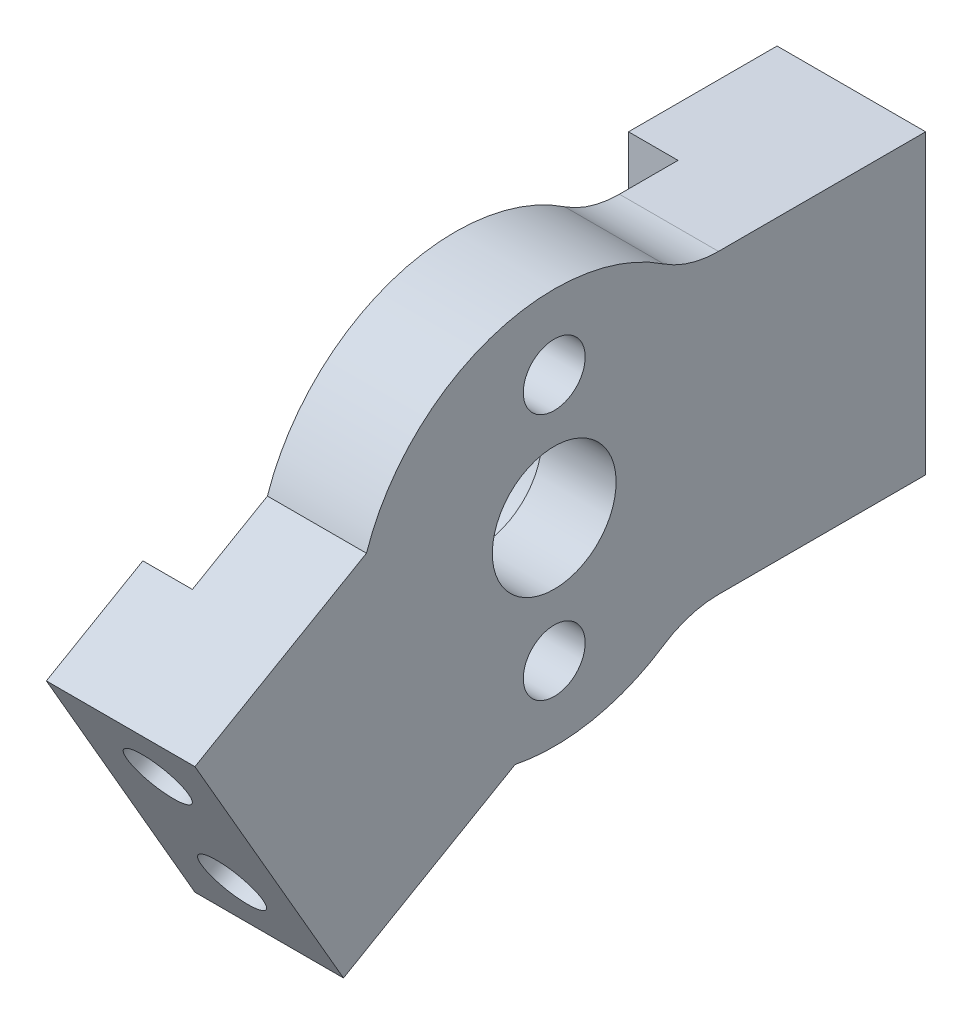
ISO-10303-21;
HEADER;
FILE_DESCRIPTION(('STEP AP214'),'2;1');
FILE_NAME('part.step','',(''),(''),'','','');
FILE_SCHEMA(('AUTOMOTIVE_DESIGN { 1 0 10303 214 1 1 1 1 }'));
ENDSEC;
DATA;
#1=APPLICATION_CONTEXT('core data for automotive mechanical design processes');
#2=APPLICATION_PROTOCOL_DEFINITION('international standard','automotive_design',2000,#1);
#3=PRODUCT_CONTEXT('',#1,'mechanical');
#4=PRODUCT('Part','Part','',(#3));
#5=PRODUCT_RELATED_PRODUCT_CATEGORY('part','',(#4));
#6=PRODUCT_DEFINITION_FORMATION('','',#4);
#7=PRODUCT_DEFINITION_CONTEXT('part definition',#1,'design');
#8=PRODUCT_DEFINITION('design','',#6,#7);
#9=PRODUCT_DEFINITION_SHAPE('','',#8);
#10=(LENGTH_UNIT() NAMED_UNIT(*) SI_UNIT(.MILLI.,.METRE.));
#11=(NAMED_UNIT(*) PLANE_ANGLE_UNIT() SI_UNIT($,.RADIAN.));
#12=(NAMED_UNIT(*) SI_UNIT($,.STERADIAN.) SOLID_ANGLE_UNIT());
#13=UNCERTAINTY_MEASURE_WITH_UNIT(LENGTH_MEASURE(1.E-05),#10,'distance_accuracy_value','');
#14=(GEOMETRIC_REPRESENTATION_CONTEXT(3) GLOBAL_UNCERTAINTY_ASSIGNED_CONTEXT((#13)) GLOBAL_UNIT_ASSIGNED_CONTEXT((#10,
#11,#12)) REPRESENTATION_CONTEXT('',''));
#15=CARTESIAN_POINT('',(0.,0.,0.));
#16=DIRECTION('',(0.,0.,1.));
#17=DIRECTION('',(1.,0.,0.));
#18=AXIS2_PLACEMENT_3D('',#15,#16,#17);
#19=CARTESIAN_POINT('',(-2.,4.3,7.));
#20=DIRECTION('',(1.,0.,0.));
#21=DIRECTION('',(0.,1.,0.));
#22=AXIS2_PLACEMENT_3D('',#19,#20,#21);
#23=PLANE('',#22);
#24=CARTESIAN_POINT('',(-2.,0.,15.));
#25=DIRECTION('',(-1.,0.,0.));
#26=DIRECTION('',(0.,-1.,0.));
#27=AXIS2_PLACEMENT_3D('',#24,#25,#26);
#28=CIRCLE('',#27,3.);
#29=CARTESIAN_POINT('',(-2.,-3.,15.));
#30=VERTEX_POINT('',#29);
#31=EDGE_CURVE('E198',#30,#30,#28,.T.);
#32=ORIENTED_EDGE('',*,*,#31,.F.);
#33=EDGE_LOOP('',(#32));
#34=FACE_BOUND('',#33,.T.);
#35=CARTESIAN_POINT('',(-2.,-5.,15.));
#36=DIRECTION('',(-1.,0.,0.));
#37=DIRECTION('',(0.,-1.,0.));
#38=AXIS2_PLACEMENT_3D('',#35,#36,#37);
#39=CIRCLE('',#38,1.25);
#40=CARTESIAN_POINT('',(-2.,-6.25,15.));
#41=VERTEX_POINT('',#40);
#42=EDGE_CURVE('E192',#41,#41,#39,.T.);
#43=ORIENTED_EDGE('',*,*,#42,.F.);
#44=EDGE_LOOP('',(#43));
#45=FACE_BOUND('',#44,.T.);
#46=CARTESIAN_POINT('',(-2.,5.,15.));
#47=DIRECTION('',(-1.,0.,0.));
#48=DIRECTION('',(0.,-1.,0.));
#49=AXIS2_PLACEMENT_3D('',#46,#47,#48);
#50=CIRCLE('',#49,1.25);
#51=CARTESIAN_POINT('',(-2.,3.75,15.));
#52=VERTEX_POINT('',#51);
#53=EDGE_CURVE('E186',#52,#52,#50,.T.);
#54=ORIENTED_EDGE('',*,*,#53,.F.);
#55=EDGE_LOOP('',(#54));
#56=FACE_BOUND('',#55,.T.);
#57=DIRECTION('',(0.,-0.866025403784439,-0.5));
#58=VECTOR('',#57,1.);
#59=CARTESIAN_POINT('',(-2.,0.800401111642026,25.6136646082014));
#60=LINE('',#59,#58);
#61=CARTESIAN_POINT('',(-2.,0.800401111642026,25.6136646082014));
#62=VERTEX_POINT('',#61);
#63=CARTESIAN_POINT('',(-2.,-9.59190373377123,19.6136646082014));
#64=VERTEX_POINT('',#63);
#65=EDGE_CURVE('E152',#62,#64,#60,.T.);
#66=ORIENTED_EDGE('',*,*,#65,.F.);
#67=DIRECTION('',(0.,0.500000000000001,-0.866025403784438));
#68=VECTOR('',#67,1.);
#69=CARTESIAN_POINT('',(-2.,-2.49486160007111,31.3212270491757));
#70=LINE('',#69,#68);
#71=CARTESIAN_POINT('',(-2.,2.55040111164203,22.5825756949558));
#72=VERTEX_POINT('',#71);
#73=EDGE_CURVE('E139',#62,#72,#70,.T.);
#74=ORIENTED_EDGE('',*,*,#73,.T.);
#75=CARTESIAN_POINT('',(-2.,0.,15.));
#76=DIRECTION('',(1.,0.,0.));
#77=DIRECTION('',(0.,1.,0.));
#78=AXIS2_PLACEMENT_3D('',#75,#76,#77);
#79=CIRCLE('',#78,8.);
#80=CARTESIAN_POINT('',(-2.,6.66666666666667,10.5778336128595));
#81=VERTEX_POINT('',#80);
#82=EDGE_CURVE('E205',#81,#72,#79,.T.);
#83=ORIENTED_EDGE('',*,*,#82,.F.);
#84=CARTESIAN_POINT('',(-2.,10.,8.3667504192892));
#85=DIRECTION('',(1.,0.,0.));
#86=DIRECTION('',(0.,1.,0.));
#87=AXIS2_PLACEMENT_3D('',#84,#85,#86);
#88=CIRCLE('',#87,4.);
#89=CARTESIAN_POINT('',(-2.,6.,8.3667504192892));
#90=VERTEX_POINT('',#89);
#91=EDGE_CURVE('E272',#81,#90,#88,.T.);
#92=ORIENTED_EDGE('',*,*,#91,.T.);
#93=DIRECTION('',(0.,0.,1.));
#94=VECTOR('',#93,1.);
#95=CARTESIAN_POINT('',(-2.,6.,9.70849737787082));
#96=LINE('',#95,#94);
#97=CARTESIAN_POINT('',(-2.,6.,6.));
#98=VERTEX_POINT('',#97);
#99=EDGE_CURVE('E210',#98,#90,#96,.T.);
#100=ORIENTED_EDGE('',*,*,#99,.F.);
#101=DIRECTION('',(0.,-1.,0.));
#102=VECTOR('',#101,1.);
#103=CARTESIAN_POINT('',(-2.,4.3,6.));
#104=LINE('',#103,#102);
#105=CARTESIAN_POINT('',(-2.,-6.,6.));
#106=VERTEX_POINT('',#105);
#107=EDGE_CURVE('E226',#98,#106,#104,.T.);
#108=ORIENTED_EDGE('',*,*,#107,.T.);
#109=DIRECTION('',(0.,0.,-1.));
#110=VECTOR('',#109,1.);
#111=CARTESIAN_POINT('',(-2.,-6.,6.));
#112=LINE('',#111,#110);
#113=CARTESIAN_POINT('',(-2.,-6.,8.3667504192892));
#114=VERTEX_POINT('',#113);
#115=EDGE_CURVE('E207',#114,#106,#112,.T.);
#116=ORIENTED_EDGE('',*,*,#115,.F.);
#117=CARTESIAN_POINT('',(-2.,-10.,8.3667504192892));
#118=DIRECTION('',(1.,0.,0.));
#119=DIRECTION('',(0.,1.,0.));
#120=AXIS2_PLACEMENT_3D('',#117,#118,#119);
#121=CIRCLE('',#120,4.);
#122=CARTESIAN_POINT('',(-2.,-6.66666666666667,10.5778336128595));
#123=VERTEX_POINT('',#122);
#124=EDGE_CURVE('E11',#114,#123,#121,.T.);
#125=ORIENTED_EDGE('',*,*,#124,.T.);
#126=CARTESIAN_POINT('',(-2.,-7.84190373377122,16.5825756949558));
#127=VERTEX_POINT('',#126);
#128=EDGE_CURVE('E208',#127,#123,#79,.T.);
#129=ORIENTED_EDGE('',*,*,#128,.F.);
#130=DIRECTION('',(0.,0.500000000000001,-0.866025403784438));
#131=VECTOR('',#130,1.);
#132=CARTESIAN_POINT('',(-2.,-12.8871664454844,25.3212270491757));
#133=LINE('',#132,#131);
#134=EDGE_CURVE('E51',#64,#127,#133,.T.);
#135=ORIENTED_EDGE('',*,*,#134,.F.);
#136=EDGE_LOOP('',(#66,#74,#83,#92,#100,#108,#116,#125,#129,#135));
#137=FACE_BOUND('',#136,.T.);
#138=ADVANCED_FACE('F36',(#34,#45,#56,#137),#23,.F.);
#139=CARTESIAN_POINT('',(-2.,0.,15.));
#140=DIRECTION('',(1.,0.,0.));
#141=DIRECTION('',(0.,1.,0.));
#142=AXIS2_PLACEMENT_3D('',#139,#140,#141);
#143=CYLINDRICAL_SURFACE('',#142,8.);
#144=CARTESIAN_POINT('',(2.,0.,15.));
#145=DIRECTION('',(1.,0.,0.));
#146=DIRECTION('',(0.,1.,0.));
#147=AXIS2_PLACEMENT_3D('',#144,#145,#146);
#148=CIRCLE('',#147,8.);
#149=CARTESIAN_POINT('',(2.,-7.84190373377122,16.5825756949558));
#150=VERTEX_POINT('',#149);
#151=CARTESIAN_POINT('',(2.,-6.66666666666667,10.5778336128595));
#152=VERTEX_POINT('',#151);
#153=EDGE_CURVE('E202',#150,#152,#148,.T.);
#154=ORIENTED_EDGE('',*,*,#153,.F.);
#155=DIRECTION('',(-1.,0.,0.));
#156=VECTOR('',#155,1.);
#157=CARTESIAN_POINT('',(21.3462367794518,-7.84190373377122,16.5825756949558));
#158=LINE('',#157,#156);
#159=EDGE_CURVE('E58',#150,#127,#158,.T.);
#160=ORIENTED_EDGE('',*,*,#159,.T.);
#161=ORIENTED_EDGE('',*,*,#128,.T.);
#162=DIRECTION('',(1.,0.,0.));
#163=VECTOR('',#162,1.);
#164=CARTESIAN_POINT('',(-2.,-6.66666666666667,10.5778336128595));
#165=LINE('',#164,#163);
#166=EDGE_CURVE('E263',#123,#152,#165,.T.);
#167=ORIENTED_EDGE('',*,*,#166,.T.);
#168=EDGE_LOOP('',(#154,#160,#161,#167));
#169=FACE_BOUND('',#168,.T.);
#170=ADVANCED_FACE('F363',(#169),#143,.T.);
#171=CARTESIAN_POINT('',(-4.,-6.,6.));
#172=DIRECTION('',(0.,0.,1.));
#173=DIRECTION('',(1.,0.,0.));
#174=AXIS2_PLACEMENT_3D('',#171,#172,#173);
#175=PLANE('',#174);
#176=DIRECTION('',(1.,0.,0.));
#177=VECTOR('',#176,1.);
#178=CARTESIAN_POINT('',(-4.,-6.,6.));
#179=LINE('',#178,#177);
#180=CARTESIAN_POINT('',(-4.,-6.,6.));
#181=VERTEX_POINT('',#180);
#182=EDGE_CURVE('E235',#181,#106,#179,.T.);
#183=ORIENTED_EDGE('',*,*,#182,.T.);
#184=ORIENTED_EDGE('',*,*,#107,.F.);
#185=DIRECTION('',(-1.,0.,0.));
#186=VECTOR('',#185,1.);
#187=CARTESIAN_POINT('',(-4.,6.,6.));
#188=LINE('',#187,#186);
#189=CARTESIAN_POINT('',(-4.,6.,6.));
#190=VERTEX_POINT('',#189);
#191=EDGE_CURVE('E239',#98,#190,#188,.T.);
#192=ORIENTED_EDGE('',*,*,#191,.T.);
#193=DIRECTION('',(0.,-1.,0.));
#194=VECTOR('',#193,1.);
#195=CARTESIAN_POINT('',(-4.,6.,6.));
#196=LINE('',#195,#194);
#197=EDGE_CURVE('E232',#190,#181,#196,.T.);
#198=ORIENTED_EDGE('',*,*,#197,.T.);
#199=EDGE_LOOP('',(#183,#184,#192,#198));
#200=FACE_BOUND('',#199,.T.);
#201=ADVANCED_FACE('F291',(#200),#175,.T.);
#202=CARTESIAN_POINT('',(-4.,6.,6.));
#203=DIRECTION('',(1.,0.,0.));
#204=DIRECTION('',(0.,1.,0.));
#205=AXIS2_PLACEMENT_3D('',#202,#203,#204);
#206=PLANE('',#205);
#207=DIRECTION('',(0.,-1.,0.));
#208=VECTOR('',#207,1.);
#209=CARTESIAN_POINT('',(-4.,6.,0.));
#210=LINE('',#209,#208);
#211=CARTESIAN_POINT('',(-4.,6.,0.));
#212=VERTEX_POINT('',#211);
#213=CARTESIAN_POINT('',(-4.,-6.,0.));
#214=VERTEX_POINT('',#213);
#215=EDGE_CURVE('E231',#212,#214,#210,.T.);
#216=ORIENTED_EDGE('',*,*,#215,.T.);
#217=DIRECTION('',(0.,0.,-1.));
#218=VECTOR('',#217,1.);
#219=CARTESIAN_POINT('',(-4.,-6.,6.));
#220=LINE('',#219,#218);
#221=EDGE_CURVE('E257',#181,#214,#220,.T.);
#222=ORIENTED_EDGE('',*,*,#221,.F.);
#223=ORIENTED_EDGE('',*,*,#197,.F.);
#224=DIRECTION('',(0.,0.,-1.));
#225=VECTOR('',#224,1.);
#226=CARTESIAN_POINT('',(-4.,6.,6.));
#227=LINE('',#226,#225);
#228=EDGE_CURVE('E241',#190,#212,#227,.T.);
#229=ORIENTED_EDGE('',*,*,#228,.T.);
#230=EDGE_LOOP('',(#216,#222,#223,#229));
#231=FACE_BOUND('',#230,.T.);
#232=ADVANCED_FACE('F295',(#231),#206,.F.);
#233=CARTESIAN_POINT('',(-4.,-6.,6.));
#234=DIRECTION('',(0.,1.,0.));
#235=DIRECTION('',(0.,0.,1.));
#236=AXIS2_PLACEMENT_3D('',#233,#234,#235);
#237=PLANE('',#236);
#238=DIRECTION('',(0.,0.,-1.));
#239=VECTOR('',#238,1.);
#240=CARTESIAN_POINT('',(2.,-6.,6.));
#241=LINE('',#240,#239);
#242=CARTESIAN_POINT('',(2.,-6.,8.3667504192892));
#243=VERTEX_POINT('',#242);
#244=CARTESIAN_POINT('',(2.,-6.,0.));
#245=VERTEX_POINT('',#244);
#246=EDGE_CURVE('E255',#243,#245,#241,.T.);
#247=ORIENTED_EDGE('',*,*,#246,.F.);
#248=DIRECTION('',(1.,0.,0.));
#249=VECTOR('',#248,1.);
#250=CARTESIAN_POINT('',(-4.,-6.,8.3667504192892));
#251=LINE('',#250,#249);
#252=EDGE_CURVE('E268',#243,#114,#251,.F.);
#253=ORIENTED_EDGE('',*,*,#252,.T.);
#254=ORIENTED_EDGE('',*,*,#115,.T.);
#255=ORIENTED_EDGE('',*,*,#182,.F.);
#256=ORIENTED_EDGE('',*,*,#221,.T.);
#257=DIRECTION('',(1.,0.,0.));
#258=VECTOR('',#257,1.);
#259=CARTESIAN_POINT('',(-4.,-6.,0.));
#260=LINE('',#259,#258);
#261=EDGE_CURVE('E244',#214,#245,#260,.T.);
#262=ORIENTED_EDGE('',*,*,#261,.T.);
#263=EDGE_LOOP('',(#247,#253,#254,#255,#256,#262));
#264=FACE_BOUND('',#263,.T.);
#265=ADVANCED_FACE('F283',(#264),#237,.F.);
#266=CARTESIAN_POINT('',(2.,6.,6.));
#267=DIRECTION('',(-1.,0.,0.));
#268=DIRECTION('',(0.,-1.,0.));
#269=AXIS2_PLACEMENT_3D('',#266,#267,#268);
#270=PLANE('',#269);
#271=CARTESIAN_POINT('',(2.,0.,15.));
#272=DIRECTION('',(-1.,0.,0.));
#273=DIRECTION('',(0.,-1.,0.));
#274=AXIS2_PLACEMENT_3D('',#271,#272,#273);
#275=CIRCLE('',#274,2.5);
#276=CARTESIAN_POINT('',(2.,-2.5,15.));
#277=VERTEX_POINT('',#276);
#278=EDGE_CURVE('E183',#277,#277,#275,.F.);
#279=ORIENTED_EDGE('',*,*,#278,.F.);
#280=EDGE_LOOP('',(#279));
#281=FACE_BOUND('',#280,.T.);
#282=CARTESIAN_POINT('',(2.,5.,15.));
#283=DIRECTION('',(-1.,0.,0.));
#284=DIRECTION('',(0.,-1.,0.));
#285=AXIS2_PLACEMENT_3D('',#282,#283,#284);
#286=CIRCLE('',#285,1.25);
#287=CARTESIAN_POINT('',(2.,3.75,15.));
#288=VERTEX_POINT('',#287);
#289=EDGE_CURVE('E189',#288,#288,#286,.F.);
#290=ORIENTED_EDGE('',*,*,#289,.F.);
#291=EDGE_LOOP('',(#290));
#292=FACE_BOUND('',#291,.T.);
#293=CARTESIAN_POINT('',(2.,-5.,15.));
#294=DIRECTION('',(-1.,0.,0.));
#295=DIRECTION('',(0.,-1.,0.));
#296=AXIS2_PLACEMENT_3D('',#293,#294,#295);
#297=CIRCLE('',#296,1.25);
#298=CARTESIAN_POINT('',(2.,-6.25,15.));
#299=VERTEX_POINT('',#298);
#300=EDGE_CURVE('E195',#299,#299,#297,.F.);
#301=ORIENTED_EDGE('',*,*,#300,.F.);
#302=EDGE_LOOP('',(#301));
#303=FACE_BOUND('',#302,.T.);
#304=DIRECTION('',(0.,0.,-1.));
#305=VECTOR('',#304,1.);
#306=CARTESIAN_POINT('',(2.,6.,6.));
#307=LINE('',#306,#305);
#308=CARTESIAN_POINT('',(2.,6.,8.3667504192892));
#309=VERTEX_POINT('',#308);
#310=CARTESIAN_POINT('',(2.,6.,0.));
#311=VERTEX_POINT('',#310);
#312=EDGE_CURVE('E253',#309,#311,#307,.T.);
#313=ORIENTED_EDGE('',*,*,#312,.F.);
#314=CARTESIAN_POINT('',(2.,10.,8.3667504192892));
#315=DIRECTION('',(-1.,0.,0.));
#316=DIRECTION('',(0.,-1.,0.));
#317=AXIS2_PLACEMENT_3D('',#314,#315,#316);
#318=CIRCLE('',#317,4.);
#319=CARTESIAN_POINT('',(2.,6.66666666666667,10.5778336128595));
#320=VERTEX_POINT('',#319);
#321=EDGE_CURVE('E270',#309,#320,#318,.T.);
#322=ORIENTED_EDGE('',*,*,#321,.T.);
#323=CARTESIAN_POINT('',(2.,2.55040111164203,22.5825756949558));
#324=VERTEX_POINT('',#323);
#325=EDGE_CURVE('E214',#320,#324,#148,.T.);
#326=ORIENTED_EDGE('',*,*,#325,.T.);
#327=DIRECTION('',(0.,-0.500000000000001,0.866025403784438));
#328=VECTOR('',#327,1.);
#329=CARTESIAN_POINT('',(2.,-2.49486160007111,31.3212270491757));
#330=LINE('',#329,#328);
#331=CARTESIAN_POINT('',(2.,-1.44959888835797,29.5107789252313));
#332=VERTEX_POINT('',#331);
#333=EDGE_CURVE('E171',#324,#332,#330,.T.);
#334=ORIENTED_EDGE('',*,*,#333,.T.);
#335=DIRECTION('',(0.,0.866025403784438,0.500000000000001));
#336=VECTOR('',#335,1.);
#337=CARTESIAN_POINT('',(2.,-24.9463188355075,15.9449413386713));
#338=LINE('',#337,#336);
#339=CARTESIAN_POINT('',(2.,-11.8419037337712,23.5107789252313));
#340=VERTEX_POINT('',#339);
#341=EDGE_CURVE('E168',#340,#332,#338,.T.);
#342=ORIENTED_EDGE('',*,*,#341,.F.);
#343=DIRECTION('',(0.,-0.500000000000001,0.866025403784438));
#344=VECTOR('',#343,1.);
#345=CARTESIAN_POINT('',(2.,-12.8871664454844,25.3212270491757));
#346=LINE('',#345,#344);
#347=EDGE_CURVE('E166',#150,#340,#346,.T.);
#348=ORIENTED_EDGE('',*,*,#347,.F.);
#349=ORIENTED_EDGE('',*,*,#153,.T.);
#350=CARTESIAN_POINT('',(2.,-10.,8.3667504192892));
#351=DIRECTION('',(-1.,0.,0.));
#352=DIRECTION('',(0.,-1.,0.));
#353=AXIS2_PLACEMENT_3D('',#350,#351,#352);
#354=CIRCLE('',#353,4.);
#355=EDGE_CURVE('E44',#152,#243,#354,.T.);
#356=ORIENTED_EDGE('',*,*,#355,.T.);
#357=ORIENTED_EDGE('',*,*,#246,.T.);
#358=DIRECTION('',(0.,1.,0.));
#359=VECTOR('',#358,1.);
#360=CARTESIAN_POINT('',(2.,6.,0.));
#361=LINE('',#360,#359);
#362=EDGE_CURVE('E247',#245,#311,#361,.T.);
#363=ORIENTED_EDGE('',*,*,#362,.T.);
#364=EDGE_LOOP('',(#313,#322,#326,#334,#342,#348,#349,#356,#357,#363));
#365=FACE_BOUND('',#364,.T.);
#366=ADVANCED_FACE('F277',(#281,#292,#303,#365),#270,.F.);
#367=CARTESIAN_POINT('',(-4.,6.,6.));
#368=DIRECTION('',(0.,-1.,0.));
#369=DIRECTION('',(0.,0.,-1.));
#370=AXIS2_PLACEMENT_3D('',#367,#368,#369);
#371=PLANE('',#370);
#372=ORIENTED_EDGE('',*,*,#99,.T.);
#373=DIRECTION('',(1.,0.,0.));
#374=VECTOR('',#373,1.);
#375=CARTESIAN_POINT('',(-4.,6.,8.3667504192892));
#376=LINE('',#375,#374);
#377=EDGE_CURVE('E260',#90,#309,#376,.T.);
#378=ORIENTED_EDGE('',*,*,#377,.T.);
#379=ORIENTED_EDGE('',*,*,#312,.T.);
#380=DIRECTION('',(-1.,0.,0.));
#381=VECTOR('',#380,1.);
#382=CARTESIAN_POINT('',(-4.,6.,0.));
#383=LINE('',#382,#381);
#384=EDGE_CURVE('E236',#311,#212,#383,.T.);
#385=ORIENTED_EDGE('',*,*,#384,.T.);
#386=ORIENTED_EDGE('',*,*,#228,.F.);
#387=ORIENTED_EDGE('',*,*,#191,.F.);
#388=EDGE_LOOP('',(#372,#378,#379,#385,#386,#387));
#389=FACE_BOUND('',#388,.T.);
#390=ADVANCED_FACE('F302',(#389),#371,.F.);
#391=CARTESIAN_POINT('',(-4.,-6.,0.));
#392=DIRECTION('',(0.,0.,1.));
#393=DIRECTION('',(1.,0.,0.));
#394=AXIS2_PLACEMENT_3D('',#391,#392,#393);
#395=PLANE('',#394);
#396=CARTESIAN_POINT('',(-1.,-3.,0.));
#397=DIRECTION('',(0.,0.,-1.));
#398=DIRECTION('',(-1.,0.,0.));
#399=AXIS2_PLACEMENT_3D('',#396,#397,#398);
#400=CIRCLE('',#399,1.25);
#401=CARTESIAN_POINT('',(-2.25,-3.,0.));
#402=VERTEX_POINT('',#401);
#403=EDGE_CURVE('E213',#402,#402,#400,.T.);
#404=ORIENTED_EDGE('',*,*,#403,.F.);
#405=EDGE_LOOP('',(#404));
#406=FACE_BOUND('',#405,.T.);
#407=CARTESIAN_POINT('',(-1.,3.,0.));
#408=DIRECTION('',(0.,0.,-1.));
#409=DIRECTION('',(-1.,0.,0.));
#410=AXIS2_PLACEMENT_3D('',#407,#408,#409);
#411=CIRCLE('',#410,1.25);
#412=CARTESIAN_POINT('',(-2.25,3.,0.));
#413=VERTEX_POINT('',#412);
#414=EDGE_CURVE('E220',#413,#413,#411,.T.);
#415=ORIENTED_EDGE('',*,*,#414,.F.);
#416=EDGE_LOOP('',(#415));
#417=FACE_BOUND('',#416,.T.);
#418=ORIENTED_EDGE('',*,*,#215,.F.);
#419=ORIENTED_EDGE('',*,*,#384,.F.);
#420=ORIENTED_EDGE('',*,*,#362,.F.);
#421=ORIENTED_EDGE('',*,*,#261,.F.);
#422=EDGE_LOOP('',(#418,#419,#420,#421));
#423=FACE_BOUND('',#422,.T.);
#424=ADVANCED_FACE('F299',(#406,#417,#423),#395,.F.);
#425=CARTESIAN_POINT('',(-1.,3.,5.5));
#426=DIRECTION('',(0.,0.,-1.));
#427=DIRECTION('',(-1.,0.,0.));
#428=AXIS2_PLACEMENT_3D('',#425,#426,#427);
#429=CYLINDRICAL_SURFACE('',#428,1.25);
#430=CARTESIAN_POINT('',(-1.,3.,5.5));
#431=DIRECTION('',(0.,0.,-1.));
#432=DIRECTION('',(-1.,0.,0.));
#433=AXIS2_PLACEMENT_3D('',#430,#431,#432);
#434=CIRCLE('',#433,1.25);
#435=CARTESIAN_POINT('',(-2.25,3.,5.5));
#436=VERTEX_POINT('',#435);
#437=EDGE_CURVE('E223',#436,#436,#434,.T.);
#438=ORIENTED_EDGE('',*,*,#437,.F.);
#439=EDGE_LOOP('',(#438));
#440=FACE_BOUND('',#439,.T.);
#441=ORIENTED_EDGE('',*,*,#414,.T.);
#442=EDGE_LOOP('',(#441));
#443=FACE_BOUND('',#442,.T.);
#444=ADVANCED_FACE('F375',(#440,#443),#429,.F.);
#445=CARTESIAN_POINT('',(-1.,3.,5.5));
#446=DIRECTION('',(0.,0.,-1.));
#447=DIRECTION('',(-1.,0.,0.));
#448=AXIS2_PLACEMENT_3D('',#445,#446,#447);
#449=PLANE('',#448);
#450=ORIENTED_EDGE('',*,*,#437,.T.);
#451=EDGE_LOOP('',(#450));
#452=FACE_BOUND('',#451,.T.);
#453=ADVANCED_FACE('F426',(#452),#449,.T.);
#454=CARTESIAN_POINT('',(-1.,-3.,5.5));
#455=DIRECTION('',(0.,0.,-1.));
#456=DIRECTION('',(-1.,0.,0.));
#457=AXIS2_PLACEMENT_3D('',#454,#455,#456);
#458=CYLINDRICAL_SURFACE('',#457,1.25);
#459=CARTESIAN_POINT('',(-1.,-3.,5.5));
#460=DIRECTION('',(0.,0.,-1.));
#461=DIRECTION('',(-1.,0.,0.));
#462=AXIS2_PLACEMENT_3D('',#459,#460,#461);
#463=CIRCLE('',#462,1.25);
#464=CARTESIAN_POINT('',(-2.25,-3.,5.5));
#465=VERTEX_POINT('',#464);
#466=EDGE_CURVE('E217',#465,#465,#463,.T.);
#467=ORIENTED_EDGE('',*,*,#466,.F.);
#468=EDGE_LOOP('',(#467));
#469=FACE_BOUND('',#468,.T.);
#470=ORIENTED_EDGE('',*,*,#403,.T.);
#471=EDGE_LOOP('',(#470));
#472=FACE_BOUND('',#471,.T.);
#473=ADVANCED_FACE('F423',(#469,#472),#458,.F.);
#474=CARTESIAN_POINT('',(-1.,-3.,5.5));
#475=DIRECTION('',(0.,0.,-1.));
#476=DIRECTION('',(-1.,0.,0.));
#477=AXIS2_PLACEMENT_3D('',#474,#475,#476);
#478=PLANE('',#477);
#479=ORIENTED_EDGE('',*,*,#466,.T.);
#480=EDGE_LOOP('',(#479));
#481=FACE_BOUND('',#480,.T.);
#482=ADVANCED_FACE('F420',(#481),#478,.T.);
#483=DIRECTION('',(-1.,0.,0.));
#484=VECTOR('',#483,1.);
#485=CARTESIAN_POINT('',(21.3462367794518,2.55040111164204,22.5825756949558));
#486=LINE('',#485,#484);
#487=EDGE_CURVE('E146',#324,#72,#486,.T.);
#488=ORIENTED_EDGE('',*,*,#487,.F.);
#489=ORIENTED_EDGE('',*,*,#325,.F.);
#490=DIRECTION('',(1.,0.,0.));
#491=VECTOR('',#490,1.);
#492=CARTESIAN_POINT('',(-2.,6.66666666666667,10.5778336128595));
#493=LINE('',#492,#491);
#494=EDGE_CURVE('E266',#320,#81,#493,.F.);
#495=ORIENTED_EDGE('',*,*,#494,.T.);
#496=ORIENTED_EDGE('',*,*,#82,.T.);
#497=EDGE_LOOP('',(#488,#489,#495,#496));
#498=FACE_BOUND('',#497,.T.);
#499=ADVANCED_FACE('F309',(#498),#143,.T.);
#500=CARTESIAN_POINT('',(-1.,0.,15.));
#501=DIRECTION('',(-1.,0.,0.));
#502=DIRECTION('',(0.,-1.,0.));
#503=AXIS2_PLACEMENT_3D('',#500,#501,#502);
#504=CYLINDRICAL_SURFACE('',#503,3.);
#505=CARTESIAN_POINT('',(-1.,0.,15.));
#506=DIRECTION('',(-1.,0.,0.));
#507=DIRECTION('',(0.,-1.,0.));
#508=AXIS2_PLACEMENT_3D('',#505,#506,#507);
#509=CIRCLE('',#508,3.);
#510=CARTESIAN_POINT('',(-1.,-3.,15.));
#511=VERTEX_POINT('',#510);
#512=EDGE_CURVE('E199',#511,#511,#509,.T.);
#513=ORIENTED_EDGE('',*,*,#512,.F.);
#514=EDGE_LOOP('',(#513));
#515=FACE_BOUND('',#514,.T.);
#516=ORIENTED_EDGE('',*,*,#31,.T.);
#517=EDGE_LOOP('',(#516));
#518=FACE_BOUND('',#517,.T.);
#519=ADVANCED_FACE('F414',(#515,#518),#504,.F.);
#520=CARTESIAN_POINT('',(-1.,0.,15.));
#521=DIRECTION('',(-1.,0.,0.));
#522=DIRECTION('',(0.,-1.,0.));
#523=AXIS2_PLACEMENT_3D('',#520,#521,#522);
#524=PLANE('',#523);
#525=CARTESIAN_POINT('',(-1.,0.,15.));
#526=DIRECTION('',(-1.,0.,0.));
#527=DIRECTION('',(0.,-1.,0.));
#528=AXIS2_PLACEMENT_3D('',#525,#526,#527);
#529=CIRCLE('',#528,2.5);
#530=CARTESIAN_POINT('',(-1.,-2.5,15.));
#531=VERTEX_POINT('',#530);
#532=EDGE_CURVE('E180',#531,#531,#529,.T.);
#533=ORIENTED_EDGE('',*,*,#532,.F.);
#534=EDGE_LOOP('',(#533));
#535=FACE_BOUND('',#534,.T.);
#536=ORIENTED_EDGE('',*,*,#512,.T.);
#537=EDGE_LOOP('',(#536));
#538=FACE_BOUND('',#537,.T.);
#539=ADVANCED_FACE('F410',(#535,#538),#524,.T.);
#540=CARTESIAN_POINT('',(5.53553390593274,-5.,15.));
#541=DIRECTION('',(-1.,0.,0.));
#542=DIRECTION('',(0.,-1.,0.));
#543=AXIS2_PLACEMENT_3D('',#540,#541,#542);
#544=CYLINDRICAL_SURFACE('',#543,1.25);
#545=ORIENTED_EDGE('',*,*,#300,.T.);
#546=EDGE_LOOP('',(#545));
#547=FACE_BOUND('',#546,.T.);
#548=ORIENTED_EDGE('',*,*,#42,.T.);
#549=EDGE_LOOP('',(#548));
#550=FACE_BOUND('',#549,.T.);
#551=ADVANCED_FACE('F402',(#547,#550),#544,.F.);
#552=CARTESIAN_POINT('',(5.53553390593274,5.,15.));
#553=DIRECTION('',(-1.,0.,0.));
#554=DIRECTION('',(0.,-1.,0.));
#555=AXIS2_PLACEMENT_3D('',#552,#553,#554);
#556=CYLINDRICAL_SURFACE('',#555,1.25);
#557=ORIENTED_EDGE('',*,*,#289,.T.);
#558=EDGE_LOOP('',(#557));
#559=FACE_BOUND('',#558,.T.);
#560=ORIENTED_EDGE('',*,*,#53,.T.);
#561=EDGE_LOOP('',(#560));
#562=FACE_BOUND('',#561,.T.);
#563=ADVANCED_FACE('F396',(#559,#562),#556,.F.);
#564=CARTESIAN_POINT('',(9.07106781186547,0.,15.));
#565=DIRECTION('',(-1.,0.,0.));
#566=DIRECTION('',(0.,-1.,0.));
#567=AXIS2_PLACEMENT_3D('',#564,#565,#566);
#568=CYLINDRICAL_SURFACE('',#567,2.5);
#569=ORIENTED_EDGE('',*,*,#278,.T.);
#570=EDGE_LOOP('',(#569));
#571=FACE_BOUND('',#570,.T.);
#572=ORIENTED_EDGE('',*,*,#532,.T.);
#573=EDGE_LOOP('',(#572));
#574=FACE_BOUND('',#573,.T.);
#575=ADVANCED_FACE('F391',(#571,#574),#568,.F.);
#576=CARTESIAN_POINT('',(-2.,10.,8.3667504192892));
#577=DIRECTION('',(1.,0.,0.));
#578=DIRECTION('',(0.,1.,0.));
#579=AXIS2_PLACEMENT_3D('',#576,#577,#578);
#580=CYLINDRICAL_SURFACE('',#579,4.);
#581=ORIENTED_EDGE('',*,*,#91,.F.);
#582=ORIENTED_EDGE('',*,*,#494,.F.);
#583=ORIENTED_EDGE('',*,*,#321,.F.);
#584=ORIENTED_EDGE('',*,*,#377,.F.);
#585=EDGE_LOOP('',(#581,#582,#583,#584));
#586=FACE_BOUND('',#585,.T.);
#587=ADVANCED_FACE('F306',(#586),#580,.F.);
#588=CARTESIAN_POINT('',(-2.,-10.,8.3667504192892));
#589=DIRECTION('',(1.,0.,0.));
#590=DIRECTION('',(0.,1.,0.));
#591=AXIS2_PLACEMENT_3D('',#588,#589,#590);
#592=CYLINDRICAL_SURFACE('',#591,4.);
#593=ORIENTED_EDGE('',*,*,#124,.F.);
#594=ORIENTED_EDGE('',*,*,#252,.F.);
#595=ORIENTED_EDGE('',*,*,#355,.F.);
#596=ORIENTED_EDGE('',*,*,#166,.F.);
#597=EDGE_LOOP('',(#593,#594,#595,#596));
#598=FACE_BOUND('',#597,.T.);
#599=ADVANCED_FACE('F38',(#598),#592,.F.);
#600=CARTESIAN_POINT('',(21.3462367794518,-24.9463188355075,15.9449413386713));
#601=DIRECTION('',(0.,0.500000000000001,-0.866025403784438));
#602=DIRECTION('',(0.,0.866025403784438,0.500000000000001));
#603=AXIS2_PLACEMENT_3D('',#600,#601,#602);
#604=PLANE('',#603);
#605=CARTESIAN_POINT('',(-1.,-4.04767509971129,28.0107789252313));
#606=DIRECTION('',(0.,-0.500000000000001,0.866025403784438));
#607=DIRECTION('',(0.,-0.866025403784438,-0.500000000000001));
#608=AXIS2_PLACEMENT_3D('',#605,#606,#607);
#609=CIRCLE('',#608,1.25);
#610=CARTESIAN_POINT('',(-1.,-5.13020685444184,27.3857789252313));
#611=VERTEX_POINT('',#610);
#612=EDGE_CURVE('E328',#611,#611,#609,.T.);
#613=ORIENTED_EDGE('',*,*,#612,.F.);
#614=EDGE_LOOP('',(#613));
#615=FACE_BOUND('',#614,.T.);
#616=CARTESIAN_POINT('',(-1.,-9.24382752241792,25.0107789252313));
#617=DIRECTION('',(0.,-0.500000000000001,0.866025403784438));
#618=DIRECTION('',(0.,-0.866025403784438,-0.500000000000001));
#619=AXIS2_PLACEMENT_3D('',#616,#617,#618);
#620=CIRCLE('',#619,1.25);
#621=CARTESIAN_POINT('',(-1.,-10.3263592771485,24.3857789252313));
#622=VERTEX_POINT('',#621);
#623=EDGE_CURVE('E322',#622,#622,#620,.T.);
#624=ORIENTED_EDGE('',*,*,#623,.F.);
#625=EDGE_LOOP('',(#624));
#626=FACE_BOUND('',#625,.T.);
#627=DIRECTION('',(-1.,0.,0.));
#628=VECTOR('',#627,1.);
#629=CARTESIAN_POINT('',(21.3462367794518,-11.8419037337712,23.5107789252313));
#630=LINE('',#629,#628);
#631=CARTESIAN_POINT('',(-4.,-11.8419037337712,23.5107789252313));
#632=VERTEX_POINT('',#631);
#633=EDGE_CURVE('E169',#340,#632,#630,.T.);
#634=ORIENTED_EDGE('',*,*,#633,.F.);
#635=ORIENTED_EDGE('',*,*,#341,.T.);
#636=DIRECTION('',(-1.,0.,0.));
#637=VECTOR('',#636,1.);
#638=CARTESIAN_POINT('',(21.3462367794518,-1.44959888835797,29.5107789252313));
#639=LINE('',#638,#637);
#640=CARTESIAN_POINT('',(-4.,-1.44959888835797,29.5107789252313));
#641=VERTEX_POINT('',#640);
#642=EDGE_CURVE('E174',#332,#641,#639,.T.);
#643=ORIENTED_EDGE('',*,*,#642,.T.);
#644=DIRECTION('',(0.,-0.866025403784438,-0.500000000000001));
#645=VECTOR('',#644,1.);
#646=CARTESIAN_POINT('',(-4.,-11.8419037337712,23.5107789252313));
#647=LINE('',#646,#645);
#648=EDGE_CURVE('E149',#641,#632,#647,.T.);
#649=ORIENTED_EDGE('',*,*,#648,.T.);
#650=EDGE_LOOP('',(#634,#635,#643,#649));
#651=FACE_BOUND('',#650,.T.);
#652=ADVANCED_FACE('F313',(#615,#626,#651),#604,.F.);
#653=CARTESIAN_POINT('',(21.3462367794518,-12.8871664454844,25.3212270491757));
#654=DIRECTION('',(0.,0.866025403784438,0.500000000000001));
#655=DIRECTION('',(0.,-0.500000000000001,0.866025403784438));
#656=AXIS2_PLACEMENT_3D('',#653,#654,#655);
#657=PLANE('',#656);
#658=ORIENTED_EDGE('',*,*,#159,.F.);
#659=ORIENTED_EDGE('',*,*,#347,.T.);
#660=ORIENTED_EDGE('',*,*,#633,.T.);
#661=DIRECTION('',(0.,0.5,-0.866025403784439));
#662=VECTOR('',#661,1.);
#663=CARTESIAN_POINT('',(-4.,-9.59190373377124,19.6136646082014));
#664=LINE('',#663,#662);
#665=CARTESIAN_POINT('',(-4.,-9.59190373377124,19.6136646082014));
#666=VERTEX_POINT('',#665);
#667=EDGE_CURVE('E160',#632,#666,#664,.T.);
#668=ORIENTED_EDGE('',*,*,#667,.T.);
#669=DIRECTION('',(1.,0.,0.));
#670=VECTOR('',#669,1.);
#671=CARTESIAN_POINT('',(-20.0555518001942,-9.59190373377124,19.6136646082014));
#672=LINE('',#671,#670);
#673=EDGE_CURVE('E155',#666,#64,#672,.T.);
#674=ORIENTED_EDGE('',*,*,#673,.T.);
#675=ORIENTED_EDGE('',*,*,#134,.T.);
#676=EDGE_LOOP('',(#658,#659,#660,#668,#674,#675));
#677=FACE_BOUND('',#676,.T.);
#678=ADVANCED_FACE('F345',(#677),#657,.F.);
#679=CARTESIAN_POINT('',(21.3462367794518,-2.49486160007111,31.3212270491757));
#680=DIRECTION('',(0.,0.866025403784438,0.500000000000001));
#681=DIRECTION('',(0.,-0.500000000000001,0.866025403784438));
#682=AXIS2_PLACEMENT_3D('',#679,#680,#681);
#683=PLANE('',#682);
#684=ORIENTED_EDGE('',*,*,#333,.F.);
#685=ORIENTED_EDGE('',*,*,#487,.T.);
#686=ORIENTED_EDGE('',*,*,#73,.F.);
#687=DIRECTION('',(1.,0.,0.));
#688=VECTOR('',#687,1.);
#689=CARTESIAN_POINT('',(-20.0555518001942,0.800401111642024,25.6136646082014));
#690=LINE('',#689,#688);
#691=CARTESIAN_POINT('',(-4.,0.800401111642026,25.6136646082014));
#692=VERTEX_POINT('',#691);
#693=EDGE_CURVE('E143',#692,#62,#690,.T.);
#694=ORIENTED_EDGE('',*,*,#693,.F.);
#695=DIRECTION('',(0.,-0.5,0.866025403784439));
#696=VECTOR('',#695,1.);
#697=CARTESIAN_POINT('',(-4.,-1.44959888835797,29.5107789252313));
#698=LINE('',#697,#696);
#699=EDGE_CURVE('E316',#692,#641,#698,.T.);
#700=ORIENTED_EDGE('',*,*,#699,.T.);
#701=ORIENTED_EDGE('',*,*,#642,.F.);
#702=EDGE_LOOP('',(#684,#685,#686,#694,#700,#701));
#703=FACE_BOUND('',#702,.T.);
#704=ADVANCED_FACE('F140',(#703),#683,.T.);
#705=CARTESIAN_POINT('',(-20.0555518001942,0.800401111642024,25.6136646082014));
#706=DIRECTION('',(0.,-0.5,0.866025403784439));
#707=DIRECTION('',(0.,-0.866025403784439,-0.5));
#708=AXIS2_PLACEMENT_3D('',#705,#706,#707);
#709=PLANE('',#708);
#710=ORIENTED_EDGE('',*,*,#673,.F.);
#711=DIRECTION('',(0.,0.866025403784439,0.5));
#712=VECTOR('',#711,1.);
#713=CARTESIAN_POINT('',(-4.,0.800401111642027,25.6136646082014));
#714=LINE('',#713,#712);
#715=EDGE_CURVE('E159',#666,#692,#714,.T.);
#716=ORIENTED_EDGE('',*,*,#715,.T.);
#717=ORIENTED_EDGE('',*,*,#693,.T.);
#718=ORIENTED_EDGE('',*,*,#65,.T.);
#719=EDGE_LOOP('',(#710,#716,#717,#718));
#720=FACE_BOUND('',#719,.T.);
#721=ADVANCED_FACE('F158',(#720),#709,.F.);
#722=CARTESIAN_POINT('',(-4.,6.,6.));
#723=DIRECTION('',(1.,0.,0.));
#724=DIRECTION('',(0.,1.,0.));
#725=AXIS2_PLACEMENT_3D('',#722,#723,#724);
#726=PLANE('',#725);
#727=ORIENTED_EDGE('',*,*,#699,.F.);
#728=ORIENTED_EDGE('',*,*,#715,.F.);
#729=ORIENTED_EDGE('',*,*,#667,.F.);
#730=ORIENTED_EDGE('',*,*,#648,.F.);
#731=EDGE_LOOP('',(#727,#728,#729,#730));
#732=FACE_BOUND('',#731,.T.);
#733=ADVANCED_FACE('F351',(#732),#726,.F.);
#734=CARTESIAN_POINT('',(-1.,-7.24382752241791,21.5466773100936));
#735=DIRECTION('',(0.,-0.500000000000001,0.866025403784438));
#736=DIRECTION('',(0.,-0.866025403784438,-0.500000000000001));
#737=AXIS2_PLACEMENT_3D('',#734,#735,#736);
#738=CYLINDRICAL_SURFACE('',#737,1.25);
#739=CARTESIAN_POINT('',(-1.,-7.24382752241791,21.5466773100936));
#740=DIRECTION('',(0.,-0.500000000000001,0.866025403784438));
#741=DIRECTION('',(0.,-0.866025403784438,-0.500000000000001));
#742=AXIS2_PLACEMENT_3D('',#739,#740,#741);
#743=CIRCLE('',#742,1.25);
#744=CARTESIAN_POINT('',(-1.,-8.32635927714846,20.9216773100936));
#745=VERTEX_POINT('',#744);
#746=EDGE_CURVE('E156',#745,#745,#743,.T.);
#747=ORIENTED_EDGE('',*,*,#746,.F.);
#748=EDGE_LOOP('',(#747));
#749=FACE_BOUND('',#748,.T.);
#750=ORIENTED_EDGE('',*,*,#623,.T.);
#751=EDGE_LOOP('',(#750));
#752=FACE_BOUND('',#751,.T.);
#753=ADVANCED_FACE('F349',(#749,#752),#738,.F.);
#754=CARTESIAN_POINT('',(-1.,-7.24382752241791,21.5466773100936));
#755=DIRECTION('',(0.,-0.500000000000001,0.866025403784438));
#756=DIRECTION('',(0.,-0.866025403784438,-0.500000000000001));
#757=AXIS2_PLACEMENT_3D('',#754,#755,#756);
#758=PLANE('',#757);
#759=ORIENTED_EDGE('',*,*,#746,.T.);
#760=EDGE_LOOP('',(#759));
#761=FACE_BOUND('',#760,.T.);
#762=ADVANCED_FACE('F339',(#761),#758,.T.);
#763=CARTESIAN_POINT('',(-1.,-2.04767509971129,24.5466773100936));
#764=DIRECTION('',(0.,-0.500000000000001,0.866025403784438));
#765=DIRECTION('',(0.,-0.866025403784438,-0.500000000000001));
#766=AXIS2_PLACEMENT_3D('',#763,#764,#765);
#767=CYLINDRICAL_SURFACE('',#766,1.25);
#768=CARTESIAN_POINT('',(-1.,-2.04767509971129,24.5466773100936));
#769=DIRECTION('',(0.,-0.500000000000001,0.866025403784438));
#770=DIRECTION('',(0.,-0.866025403784438,-0.500000000000001));
#771=AXIS2_PLACEMENT_3D('',#768,#769,#770);
#772=CIRCLE('',#771,1.25);
#773=CARTESIAN_POINT('',(-1.,-3.13020685444184,23.9216773100936));
#774=VERTEX_POINT('',#773);
#775=EDGE_CURVE('E325',#774,#774,#772,.T.);
#776=ORIENTED_EDGE('',*,*,#775,.F.);
#777=EDGE_LOOP('',(#776));
#778=FACE_BOUND('',#777,.T.);
#779=ORIENTED_EDGE('',*,*,#612,.T.);
#780=EDGE_LOOP('',(#779));
#781=FACE_BOUND('',#780,.T.);
#782=ADVANCED_FACE('F336',(#778,#781),#767,.F.);
#783=CARTESIAN_POINT('',(-1.,-2.04767509971129,24.5466773100936));
#784=DIRECTION('',(0.,-0.500000000000001,0.866025403784438));
#785=DIRECTION('',(0.,-0.866025403784438,-0.500000000000001));
#786=AXIS2_PLACEMENT_3D('',#783,#784,#785);
#787=PLANE('',#786);
#788=ORIENTED_EDGE('',*,*,#775,.T.);
#789=EDGE_LOOP('',(#788));
#790=FACE_BOUND('',#789,.T.);
#791=ADVANCED_FACE('F334',(#790),#787,.T.);
#792=CLOSED_SHELL('',(#138,#170,#201,#232,#265,#366,#390,#424,#444,#453,#473,#482,#499,#519,
#539,#551,#563,#575,#587,#599,#652,#678,#704,#721,#733,#753,#762,#782,#791));
#793=MANIFOLD_SOLID_BREP('B2',#792);
#794=ADVANCED_BREP_SHAPE_REPRESENTATION('',(#18,#793),#14);
#795=SHAPE_DEFINITION_REPRESENTATION(#9,#794);
ENDSEC;
END-ISO-10303-21;
